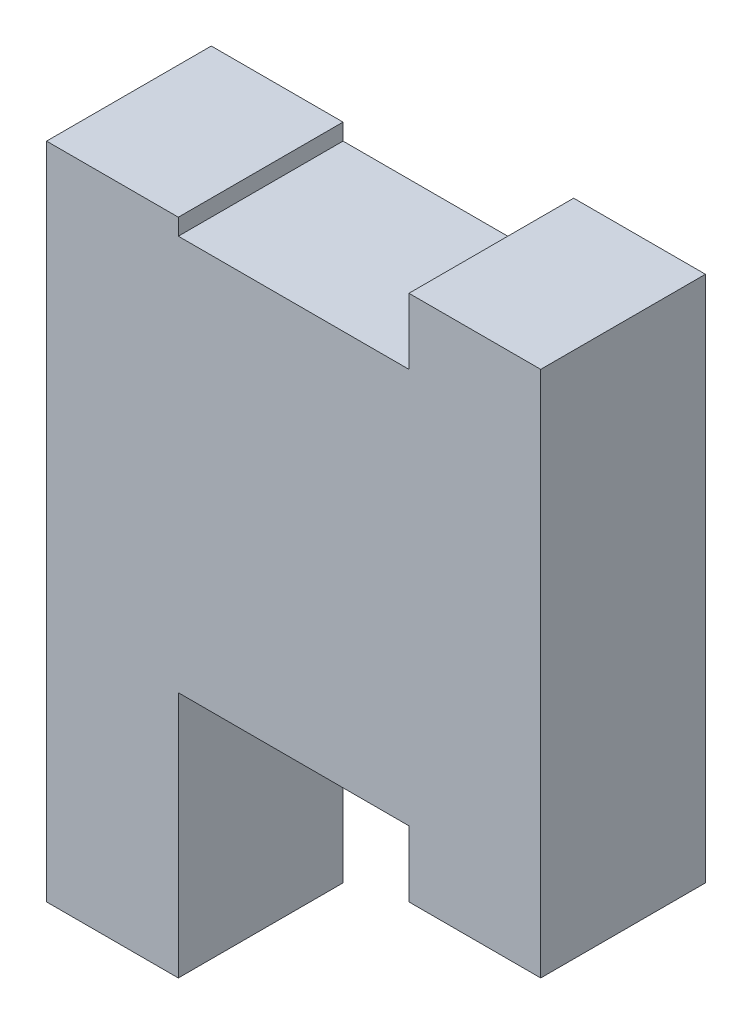
ISO-10303-21;
HEADER;
FILE_DESCRIPTION(('STEP AP214'),'2;1');
FILE_NAME('part.step','',(''),(''),'','','');
FILE_SCHEMA(('AUTOMOTIVE_DESIGN { 1 0 10303 214 1 1 1 1 }'));
ENDSEC;
DATA;
#1=APPLICATION_CONTEXT('core data for automotive mechanical design processes');
#2=APPLICATION_PROTOCOL_DEFINITION('international standard','automotive_design',2000,#1);
#3=PRODUCT_CONTEXT('',#1,'mechanical');
#4=PRODUCT('Part','Part','',(#3));
#5=PRODUCT_RELATED_PRODUCT_CATEGORY('part','',(#4));
#6=PRODUCT_DEFINITION_FORMATION('','',#4);
#7=PRODUCT_DEFINITION_CONTEXT('part definition',#1,'design');
#8=PRODUCT_DEFINITION('design','',#6,#7);
#9=PRODUCT_DEFINITION_SHAPE('','',#8);
#10=(LENGTH_UNIT() NAMED_UNIT(*) SI_UNIT(.MILLI.,.METRE.));
#11=(NAMED_UNIT(*) PLANE_ANGLE_UNIT() SI_UNIT($,.RADIAN.));
#12=(NAMED_UNIT(*) SI_UNIT($,.STERADIAN.) SOLID_ANGLE_UNIT());
#13=UNCERTAINTY_MEASURE_WITH_UNIT(LENGTH_MEASURE(1.E-05),#10,'distance_accuracy_value','');
#14=(GEOMETRIC_REPRESENTATION_CONTEXT(3) GLOBAL_UNCERTAINTY_ASSIGNED_CONTEXT((#13)) GLOBAL_UNIT_ASSIGNED_CONTEXT((#10,
#11,#12)) REPRESENTATION_CONTEXT('',''));
#15=CARTESIAN_POINT('',(0.,0.,0.));
#16=DIRECTION('',(0.,0.,1.));
#17=DIRECTION('',(1.,0.,0.));
#18=AXIS2_PLACEMENT_3D('',#15,#16,#17);
#19=CARTESIAN_POINT('',(0.2,0.,0.125));
#20=DIRECTION('',(0.,1.,0.));
#21=DIRECTION('',(-1.,0.,0.));
#22=AXIS2_PLACEMENT_3D('',#19,#20,#21);
#23=PLANE('',#22);
#24=DIRECTION('',(1.,0.,0.));
#25=VECTOR('',#24,1.);
#26=CARTESIAN_POINT('',(0.2,0.,-0.125));
#27=LINE('',#26,#25);
#28=CARTESIAN_POINT('',(0.,0.,-0.125));
#29=VERTEX_POINT('',#28);
#30=CARTESIAN_POINT('',(0.2,0.,-0.125));
#31=VERTEX_POINT('',#30);
#32=EDGE_CURVE('E165',#29,#31,#27,.T.);
#33=ORIENTED_EDGE('',*,*,#32,.T.);
#34=DIRECTION('',(0.,0.,-1.));
#35=VECTOR('',#34,1.);
#36=CARTESIAN_POINT('',(0.2,0.,0.125));
#37=LINE('',#36,#35);
#38=CARTESIAN_POINT('',(0.2,0.,0.125));
#39=VERTEX_POINT('',#38);
#40=EDGE_CURVE('E11',#39,#31,#37,.T.);
#41=ORIENTED_EDGE('',*,*,#40,.F.);
#42=DIRECTION('',(1.,0.,0.));
#43=VECTOR('',#42,1.);
#44=CARTESIAN_POINT('',(0.2,0.,0.125));
#45=LINE('',#44,#43);
#46=CARTESIAN_POINT('',(0.,0.,0.125));
#47=VERTEX_POINT('',#46);
#48=EDGE_CURVE('E198',#47,#39,#45,.T.);
#49=ORIENTED_EDGE('',*,*,#48,.F.);
#50=DIRECTION('',(0.,0.,-1.));
#51=VECTOR('',#50,1.);
#52=CARTESIAN_POINT('',(0.,0.,0.125));
#53=LINE('',#52,#51);
#54=EDGE_CURVE('E161',#47,#29,#53,.T.);
#55=ORIENTED_EDGE('',*,*,#54,.T.);
#56=EDGE_LOOP('',(#33,#41,#49,#55));
#57=FACE_BOUND('',#56,.T.);
#58=ADVANCED_FACE('F37',(#57),#23,.F.);
#59=CARTESIAN_POINT('',(0.2,0.375,0.125));
#60=DIRECTION('',(-1.,0.,0.));
#61=DIRECTION('',(0.,-1.,0.));
#62=AXIS2_PLACEMENT_3D('',#59,#60,#61);
#63=PLANE('',#62);
#64=DIRECTION('',(0.,1.,0.));
#65=VECTOR('',#64,1.);
#66=CARTESIAN_POINT('',(0.2,0.375,-0.125));
#67=LINE('',#66,#65);
#68=CARTESIAN_POINT('',(0.2,0.375,-0.125));
#69=VERTEX_POINT('',#68);
#70=EDGE_CURVE('E169',#31,#69,#67,.T.);
#71=ORIENTED_EDGE('',*,*,#70,.T.);
#72=DIRECTION('',(0.,0.,-1.));
#73=VECTOR('',#72,1.);
#74=CARTESIAN_POINT('',(0.2,0.375,0.125));
#75=LINE('',#74,#73);
#76=CARTESIAN_POINT('',(0.2,0.375,0.125));
#77=VERTEX_POINT('',#76);
#78=EDGE_CURVE('E46',#77,#69,#75,.T.);
#79=ORIENTED_EDGE('',*,*,#78,.F.);
#80=DIRECTION('',(0.,1.,0.));
#81=VECTOR('',#80,1.);
#82=CARTESIAN_POINT('',(0.2,0.375,0.125));
#83=LINE('',#82,#81);
#84=EDGE_CURVE('E109',#39,#77,#83,.T.);
#85=ORIENTED_EDGE('',*,*,#84,.F.);
#86=ORIENTED_EDGE('',*,*,#40,.T.);
#87=EDGE_LOOP('',(#71,#79,#85,#86));
#88=FACE_BOUND('',#87,.T.);
#89=ADVANCED_FACE('F311',(#88),#63,.F.);
#90=CARTESIAN_POINT('',(0.55,0.375,0.125));
#91=DIRECTION('',(0.,1.,0.));
#92=DIRECTION('',(-1.,0.,0.));
#93=AXIS2_PLACEMENT_3D('',#90,#91,#92);
#94=PLANE('',#93);
#95=DIRECTION('',(1.,0.,0.));
#96=VECTOR('',#95,1.);
#97=CARTESIAN_POINT('',(0.55,0.375,-0.125));
#98=LINE('',#97,#96);
#99=CARTESIAN_POINT('',(0.55,0.375,-0.125));
#100=VERTEX_POINT('',#99);
#101=EDGE_CURVE('E172',#69,#100,#98,.T.);
#102=ORIENTED_EDGE('',*,*,#101,.T.);
#103=DIRECTION('',(0.,0.,-1.));
#104=VECTOR('',#103,1.);
#105=CARTESIAN_POINT('',(0.55,0.375,0.125));
#106=LINE('',#105,#104);
#107=CARTESIAN_POINT('',(0.55,0.375,0.125));
#108=VERTEX_POINT('',#107);
#109=EDGE_CURVE('E224',#108,#100,#106,.T.);
#110=ORIENTED_EDGE('',*,*,#109,.F.);
#111=DIRECTION('',(1.,0.,0.));
#112=VECTOR('',#111,1.);
#113=CARTESIAN_POINT('',(0.55,0.375,0.125));
#114=LINE('',#113,#112);
#115=EDGE_CURVE('E236',#77,#108,#114,.T.);
#116=ORIENTED_EDGE('',*,*,#115,.F.);
#117=ORIENTED_EDGE('',*,*,#78,.T.);
#118=EDGE_LOOP('',(#102,#110,#116,#117));
#119=FACE_BOUND('',#118,.T.);
#120=ADVANCED_FACE('F234',(#119),#94,.F.);
#121=CARTESIAN_POINT('',(0.55,0.275,0.125));
#122=DIRECTION('',(1.,0.,0.));
#123=DIRECTION('',(0.,1.,0.));
#124=AXIS2_PLACEMENT_3D('',#121,#122,#123);
#125=PLANE('',#124);
#126=DIRECTION('',(0.,-1.,0.));
#127=VECTOR('',#126,1.);
#128=CARTESIAN_POINT('',(0.55,0.275,-0.125));
#129=LINE('',#128,#127);
#130=CARTESIAN_POINT('',(0.55,0.275,-0.125));
#131=VERTEX_POINT('',#130);
#132=EDGE_CURVE('E175',#100,#131,#129,.T.);
#133=ORIENTED_EDGE('',*,*,#132,.T.);
#134=DIRECTION('',(0.,0.,-1.));
#135=VECTOR('',#134,1.);
#136=CARTESIAN_POINT('',(0.55,0.275,0.125));
#137=LINE('',#136,#135);
#138=CARTESIAN_POINT('',(0.55,0.275,0.125));
#139=VERTEX_POINT('',#138);
#140=EDGE_CURVE('E220',#139,#131,#137,.T.);
#141=ORIENTED_EDGE('',*,*,#140,.F.);
#142=DIRECTION('',(0.,-1.,0.));
#143=VECTOR('',#142,1.);
#144=CARTESIAN_POINT('',(0.55,0.275,0.125));
#145=LINE('',#144,#143);
#146=EDGE_CURVE('E255',#108,#139,#145,.T.);
#147=ORIENTED_EDGE('',*,*,#146,.F.);
#148=ORIENTED_EDGE('',*,*,#109,.T.);
#149=EDGE_LOOP('',(#133,#141,#147,#148));
#150=FACE_BOUND('',#149,.T.);
#151=ADVANCED_FACE('F245',(#150),#125,.F.);
#152=CARTESIAN_POINT('',(0.75,0.275,0.125));
#153=DIRECTION('',(0.,1.,0.));
#154=DIRECTION('',(-1.,0.,0.));
#155=AXIS2_PLACEMENT_3D('',#152,#153,#154);
#156=PLANE('',#155);
#157=DIRECTION('',(1.,0.,0.));
#158=VECTOR('',#157,1.);
#159=CARTESIAN_POINT('',(0.75,0.275,-0.125));
#160=LINE('',#159,#158);
#161=CARTESIAN_POINT('',(0.75,0.275,-0.125));
#162=VERTEX_POINT('',#161);
#163=EDGE_CURVE('E178',#131,#162,#160,.T.);
#164=ORIENTED_EDGE('',*,*,#163,.T.);
#165=DIRECTION('',(0.,0.,-1.));
#166=VECTOR('',#165,1.);
#167=CARTESIAN_POINT('',(0.75,0.275,0.125));
#168=LINE('',#167,#166);
#169=CARTESIAN_POINT('',(0.75,0.275,0.125));
#170=VERTEX_POINT('',#169);
#171=EDGE_CURVE('E216',#170,#162,#168,.T.);
#172=ORIENTED_EDGE('',*,*,#171,.F.);
#173=DIRECTION('',(1.,0.,0.));
#174=VECTOR('',#173,1.);
#175=CARTESIAN_POINT('',(0.75,0.275,0.125));
#176=LINE('',#175,#174);
#177=EDGE_CURVE('E251',#139,#170,#176,.T.);
#178=ORIENTED_EDGE('',*,*,#177,.F.);
#179=ORIENTED_EDGE('',*,*,#140,.T.);
#180=EDGE_LOOP('',(#164,#172,#178,#179));
#181=FACE_BOUND('',#180,.T.);
#182=ADVANCED_FACE('F249',(#181),#156,.F.);
#183=CARTESIAN_POINT('',(0.75,1.075,0.125));
#184=DIRECTION('',(-1.,0.,0.));
#185=DIRECTION('',(0.,-1.,0.));
#186=AXIS2_PLACEMENT_3D('',#183,#184,#185);
#187=PLANE('',#186);
#188=DIRECTION('',(0.,1.,0.));
#189=VECTOR('',#188,1.);
#190=CARTESIAN_POINT('',(0.75,1.075,-0.125));
#191=LINE('',#190,#189);
#192=CARTESIAN_POINT('',(0.75,1.075,-0.125));
#193=VERTEX_POINT('',#192);
#194=EDGE_CURVE('E181',#162,#193,#191,.T.);
#195=ORIENTED_EDGE('',*,*,#194,.T.);
#196=DIRECTION('',(0.,0.,-1.));
#197=VECTOR('',#196,1.);
#198=CARTESIAN_POINT('',(0.75,1.075,0.125));
#199=LINE('',#198,#197);
#200=CARTESIAN_POINT('',(0.75,1.075,0.125));
#201=VERTEX_POINT('',#200);
#202=EDGE_CURVE('E212',#201,#193,#199,.T.);
#203=ORIENTED_EDGE('',*,*,#202,.F.);
#204=DIRECTION('',(0.,1.,0.));
#205=VECTOR('',#204,1.);
#206=CARTESIAN_POINT('',(0.75,1.075,0.125));
#207=LINE('',#206,#205);
#208=EDGE_CURVE('E254',#170,#201,#207,.T.);
#209=ORIENTED_EDGE('',*,*,#208,.F.);
#210=ORIENTED_EDGE('',*,*,#171,.T.);
#211=EDGE_LOOP('',(#195,#203,#209,#210));
#212=FACE_BOUND('',#211,.T.);
#213=ADVANCED_FACE('F324',(#212),#187,.F.);
#214=CARTESIAN_POINT('',(0.55,1.075,0.125));
#215=DIRECTION('',(0.,-1.,0.));
#216=DIRECTION('',(0.,0.,-1.));
#217=AXIS2_PLACEMENT_3D('',#214,#215,#216);
#218=PLANE('',#217);
#219=DIRECTION('',(-1.,0.,0.));
#220=VECTOR('',#219,1.);
#221=CARTESIAN_POINT('',(0.55,1.075,-0.125));
#222=LINE('',#221,#220);
#223=CARTESIAN_POINT('',(0.55,1.075,-0.125));
#224=VERTEX_POINT('',#223);
#225=EDGE_CURVE('E184',#193,#224,#222,.T.);
#226=ORIENTED_EDGE('',*,*,#225,.T.);
#227=DIRECTION('',(0.,0.,-1.));
#228=VECTOR('',#227,1.);
#229=CARTESIAN_POINT('',(0.55,1.075,0.125));
#230=LINE('',#229,#228);
#231=CARTESIAN_POINT('',(0.55,1.075,0.125));
#232=VERTEX_POINT('',#231);
#233=EDGE_CURVE('E208',#232,#224,#230,.T.);
#234=ORIENTED_EDGE('',*,*,#233,.F.);
#235=DIRECTION('',(-1.,0.,0.));
#236=VECTOR('',#235,1.);
#237=CARTESIAN_POINT('',(0.55,1.075,0.125));
#238=LINE('',#237,#236);
#239=EDGE_CURVE('E259',#201,#232,#238,.T.);
#240=ORIENTED_EDGE('',*,*,#239,.F.);
#241=ORIENTED_EDGE('',*,*,#202,.T.);
#242=EDGE_LOOP('',(#226,#234,#240,#241));
#243=FACE_BOUND('',#242,.T.);
#244=ADVANCED_FACE('F327',(#243),#218,.F.);
#245=CARTESIAN_POINT('',(0.55,0.975,0.125));
#246=DIRECTION('',(1.,0.,0.));
#247=DIRECTION('',(0.,1.,0.));
#248=AXIS2_PLACEMENT_3D('',#245,#246,#247);
#249=PLANE('',#248);
#250=DIRECTION('',(0.,-1.,0.));
#251=VECTOR('',#250,1.);
#252=CARTESIAN_POINT('',(0.55,0.975,-0.125));
#253=LINE('',#252,#251);
#254=CARTESIAN_POINT('',(0.55,0.975,-0.125));
#255=VERTEX_POINT('',#254);
#256=EDGE_CURVE('E187',#224,#255,#253,.T.);
#257=ORIENTED_EDGE('',*,*,#256,.T.);
#258=DIRECTION('',(0.,0.,-1.));
#259=VECTOR('',#258,1.);
#260=CARTESIAN_POINT('',(0.55,0.975,0.125));
#261=LINE('',#260,#259);
#262=CARTESIAN_POINT('',(0.55,0.975,0.125));
#263=VERTEX_POINT('',#262);
#264=EDGE_CURVE('E204',#263,#255,#261,.T.);
#265=ORIENTED_EDGE('',*,*,#264,.F.);
#266=DIRECTION('',(0.,-1.,0.));
#267=VECTOR('',#266,1.);
#268=CARTESIAN_POINT('',(0.55,0.975,0.125));
#269=LINE('',#268,#267);
#270=EDGE_CURVE('E267',#232,#263,#269,.T.);
#271=ORIENTED_EDGE('',*,*,#270,.F.);
#272=ORIENTED_EDGE('',*,*,#233,.T.);
#273=EDGE_LOOP('',(#257,#265,#271,#272));
#274=FACE_BOUND('',#273,.T.);
#275=ADVANCED_FACE('F292',(#274),#249,.F.);
#276=CARTESIAN_POINT('',(0.2,0.975,0.125));
#277=DIRECTION('',(0.,-1.,0.));
#278=DIRECTION('',(1.,0.,0.));
#279=AXIS2_PLACEMENT_3D('',#276,#277,#278);
#280=PLANE('',#279);
#281=DIRECTION('',(-1.,0.,0.));
#282=VECTOR('',#281,1.);
#283=CARTESIAN_POINT('',(0.2,0.975,-0.125));
#284=LINE('',#283,#282);
#285=CARTESIAN_POINT('',(0.2,0.975,-0.125));
#286=VERTEX_POINT('',#285);
#287=EDGE_CURVE('E190',#255,#286,#284,.T.);
#288=ORIENTED_EDGE('',*,*,#287,.T.);
#289=DIRECTION('',(0.,0.,-1.));
#290=VECTOR('',#289,1.);
#291=CARTESIAN_POINT('',(0.2,0.975,0.125));
#292=LINE('',#291,#290);
#293=CARTESIAN_POINT('',(0.2,0.975,0.125));
#294=VERTEX_POINT('',#293);
#295=EDGE_CURVE('E151',#294,#286,#292,.T.);
#296=ORIENTED_EDGE('',*,*,#295,.F.);
#297=DIRECTION('',(-1.,0.,0.));
#298=VECTOR('',#297,1.);
#299=CARTESIAN_POINT('',(0.2,0.975,0.125));
#300=LINE('',#299,#298);
#301=EDGE_CURVE('E140',#263,#294,#300,.T.);
#302=ORIENTED_EDGE('',*,*,#301,.F.);
#303=ORIENTED_EDGE('',*,*,#264,.T.);
#304=EDGE_LOOP('',(#288,#296,#302,#303));
#305=FACE_BOUND('',#304,.T.);
#306=ADVANCED_FACE('F296',(#305),#280,.F.);
#307=CARTESIAN_POINT('',(0.2,1.,0.125));
#308=DIRECTION('',(-1.,0.,0.));
#309=DIRECTION('',(0.,-1.,0.));
#310=AXIS2_PLACEMENT_3D('',#307,#308,#309);
#311=PLANE('',#310);
#312=DIRECTION('',(0.,1.,0.));
#313=VECTOR('',#312,1.);
#314=CARTESIAN_POINT('',(0.2,1.,-0.125));
#315=LINE('',#314,#313);
#316=CARTESIAN_POINT('',(0.2,1.,-0.125));
#317=VERTEX_POINT('',#316);
#318=EDGE_CURVE('E149',#286,#317,#315,.T.);
#319=ORIENTED_EDGE('',*,*,#318,.T.);
#320=DIRECTION('',(0.,0.,-1.));
#321=VECTOR('',#320,1.);
#322=CARTESIAN_POINT('',(0.2,1.,0.125));
#323=LINE('',#322,#321);
#324=CARTESIAN_POINT('',(0.2,1.,0.125));
#325=VERTEX_POINT('',#324);
#326=EDGE_CURVE('E146',#325,#317,#323,.T.);
#327=ORIENTED_EDGE('',*,*,#326,.F.);
#328=DIRECTION('',(0.,1.,0.));
#329=VECTOR('',#328,1.);
#330=CARTESIAN_POINT('',(0.2,1.,0.125));
#331=LINE('',#330,#329);
#332=EDGE_CURVE('E134',#294,#325,#331,.T.);
#333=ORIENTED_EDGE('',*,*,#332,.F.);
#334=ORIENTED_EDGE('',*,*,#295,.T.);
#335=EDGE_LOOP('',(#319,#327,#333,#334));
#336=FACE_BOUND('',#335,.T.);
#337=ADVANCED_FACE('F147',(#336),#311,.F.);
#338=CARTESIAN_POINT('',(0.,1.,0.125));
#339=DIRECTION('',(0.,-1.,0.));
#340=DIRECTION('',(0.,0.,-1.));
#341=AXIS2_PLACEMENT_3D('',#338,#339,#340);
#342=PLANE('',#341);
#343=DIRECTION('',(-1.,0.,0.));
#344=VECTOR('',#343,1.);
#345=CARTESIAN_POINT('',(0.,1.,-0.125));
#346=LINE('',#345,#344);
#347=CARTESIAN_POINT('',(0.,1.,-0.125));
#348=VERTEX_POINT('',#347);
#349=EDGE_CURVE('E95',#317,#348,#346,.T.);
#350=ORIENTED_EDGE('',*,*,#349,.T.);
#351=DIRECTION('',(0.,0.,-1.));
#352=VECTOR('',#351,1.);
#353=CARTESIAN_POINT('',(0.,1.,0.125));
#354=LINE('',#353,#352);
#355=CARTESIAN_POINT('',(0.,1.,0.125));
#356=VERTEX_POINT('',#355);
#357=EDGE_CURVE('E152',#356,#348,#354,.T.);
#358=ORIENTED_EDGE('',*,*,#357,.F.);
#359=DIRECTION('',(-1.,0.,0.));
#360=VECTOR('',#359,1.);
#361=CARTESIAN_POINT('',(0.,1.,0.125));
#362=LINE('',#361,#360);
#363=EDGE_CURVE('E138',#325,#356,#362,.T.);
#364=ORIENTED_EDGE('',*,*,#363,.F.);
#365=ORIENTED_EDGE('',*,*,#326,.T.);
#366=EDGE_LOOP('',(#350,#358,#364,#365));
#367=FACE_BOUND('',#366,.T.);
#368=ADVANCED_FACE('F154',(#367),#342,.F.);
#369=CARTESIAN_POINT('',(0.,0.,0.125));
#370=DIRECTION('',(1.,0.,0.));
#371=DIRECTION('',(0.,0.,-1.));
#372=AXIS2_PLACEMENT_3D('',#369,#370,#371);
#373=PLANE('',#372);
#374=DIRECTION('',(0.,-1.,0.));
#375=VECTOR('',#374,1.);
#376=CARTESIAN_POINT('',(0.,0.,-0.125));
#377=LINE('',#376,#375);
#378=EDGE_CURVE('E101',#348,#29,#377,.T.);
#379=ORIENTED_EDGE('',*,*,#378,.T.);
#380=ORIENTED_EDGE('',*,*,#54,.F.);
#381=DIRECTION('',(0.,-1.,0.));
#382=VECTOR('',#381,1.);
#383=CARTESIAN_POINT('',(0.,0.,0.125));
#384=LINE('',#383,#382);
#385=EDGE_CURVE('E54',#356,#47,#384,.T.);
#386=ORIENTED_EDGE('',*,*,#385,.F.);
#387=ORIENTED_EDGE('',*,*,#357,.T.);
#388=EDGE_LOOP('',(#379,#380,#386,#387));
#389=FACE_BOUND('',#388,.T.);
#390=ADVANCED_FACE('F300',(#389),#373,.F.);
#391=CARTESIAN_POINT('',(0.,0.,0.125));
#392=DIRECTION('',(0.,0.,-1.));
#393=DIRECTION('',(-1.,0.,0.));
#394=AXIS2_PLACEMENT_3D('',#391,#392,#393);
#395=PLANE('',#394);
#396=ORIENTED_EDGE('',*,*,#48,.T.);
#397=ORIENTED_EDGE('',*,*,#84,.T.);
#398=ORIENTED_EDGE('',*,*,#115,.T.);
#399=ORIENTED_EDGE('',*,*,#146,.T.);
#400=ORIENTED_EDGE('',*,*,#177,.T.);
#401=ORIENTED_EDGE('',*,*,#208,.T.);
#402=ORIENTED_EDGE('',*,*,#239,.T.);
#403=ORIENTED_EDGE('',*,*,#270,.T.);
#404=ORIENTED_EDGE('',*,*,#301,.T.);
#405=ORIENTED_EDGE('',*,*,#332,.T.);
#406=ORIENTED_EDGE('',*,*,#363,.T.);
#407=ORIENTED_EDGE('',*,*,#385,.T.);
#408=EDGE_LOOP('',(#396,#397,#398,#399,#400,#401,#402,#403,#404,#405,#406,#407));
#409=FACE_BOUND('',#408,.T.);
#410=ADVANCED_FACE('F136',(#409),#395,.F.);
#411=CARTESIAN_POINT('',(0.,0.,-0.125));
#412=DIRECTION('',(0.,0.,-1.));
#413=DIRECTION('',(-1.,0.,0.));
#414=AXIS2_PLACEMENT_3D('',#411,#412,#413);
#415=PLANE('',#414);
#416=ORIENTED_EDGE('',*,*,#32,.F.);
#417=ORIENTED_EDGE('',*,*,#378,.F.);
#418=ORIENTED_EDGE('',*,*,#349,.F.);
#419=ORIENTED_EDGE('',*,*,#318,.F.);
#420=ORIENTED_EDGE('',*,*,#287,.F.);
#421=ORIENTED_EDGE('',*,*,#256,.F.);
#422=ORIENTED_EDGE('',*,*,#225,.F.);
#423=ORIENTED_EDGE('',*,*,#194,.F.);
#424=ORIENTED_EDGE('',*,*,#163,.F.);
#425=ORIENTED_EDGE('',*,*,#132,.F.);
#426=ORIENTED_EDGE('',*,*,#101,.F.);
#427=ORIENTED_EDGE('',*,*,#70,.F.);
#428=EDGE_LOOP('',(#416,#417,#418,#419,#420,#421,#422,#423,#424,#425,#426,#427));
#429=FACE_BOUND('',#428,.T.);
#430=ADVANCED_FACE('F240',(#429),#415,.T.);
#431=CLOSED_SHELL('',(#58,#89,#120,#151,#182,#213,#244,#275,#306,#337,#368,#390,#410,#430));
#432=MANIFOLD_SOLID_BREP('B2',#431);
#433=ADVANCED_BREP_SHAPE_REPRESENTATION('',(#18,#432),#14);
#434=SHAPE_DEFINITION_REPRESENTATION(#9,#433);
ENDSEC;
END-ISO-10303-21;
